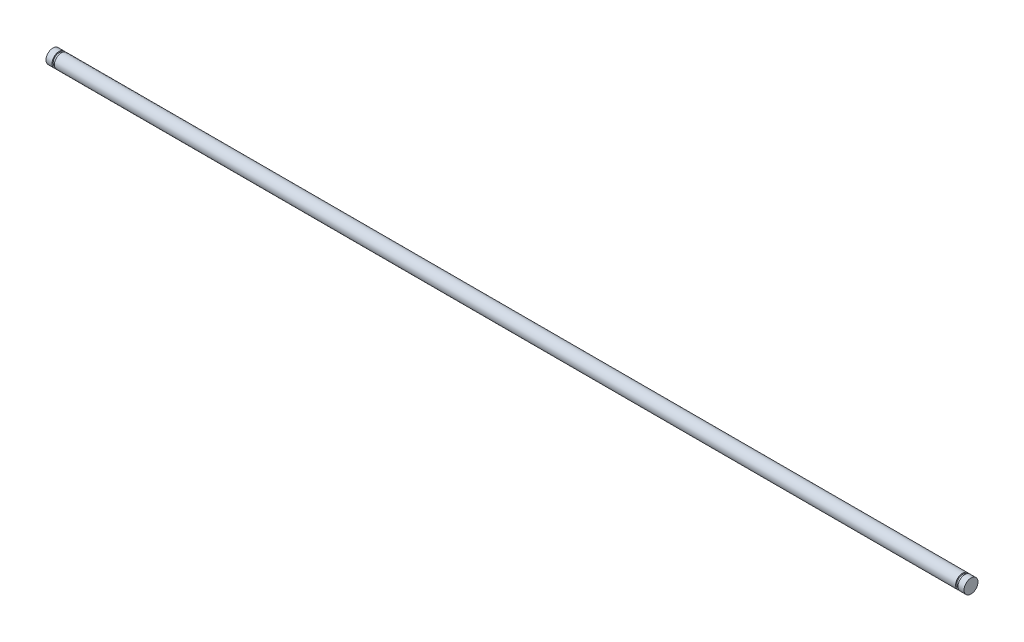
ISO-10303-21;
HEADER;
FILE_DESCRIPTION(('STEP AP214'),'2;1');
FILE_NAME('part.step','',(''),(''),'','','');
FILE_SCHEMA(('AUTOMOTIVE_DESIGN { 1 0 10303 214 1 1 1 1 }'));
ENDSEC;
DATA;
#1=APPLICATION_CONTEXT('core data for automotive mechanical design processes');
#2=APPLICATION_PROTOCOL_DEFINITION('international standard','automotive_design',2000,#1);
#3=PRODUCT_CONTEXT('',#1,'mechanical');
#4=PRODUCT('Part','Part','',(#3));
#5=PRODUCT_RELATED_PRODUCT_CATEGORY('part','',(#4));
#6=PRODUCT_DEFINITION_FORMATION('','',#4);
#7=PRODUCT_DEFINITION_CONTEXT('part definition',#1,'design');
#8=PRODUCT_DEFINITION('design','',#6,#7);
#9=PRODUCT_DEFINITION_SHAPE('','',#8);
#10=(LENGTH_UNIT() NAMED_UNIT(*) SI_UNIT(.MILLI.,.METRE.));
#11=(NAMED_UNIT(*) PLANE_ANGLE_UNIT() SI_UNIT($,.RADIAN.));
#12=(NAMED_UNIT(*) SI_UNIT($,.STERADIAN.) SOLID_ANGLE_UNIT());
#13=UNCERTAINTY_MEASURE_WITH_UNIT(LENGTH_MEASURE(1.E-05),#10,'distance_accuracy_value','');
#14=(GEOMETRIC_REPRESENTATION_CONTEXT(3) GLOBAL_UNCERTAINTY_ASSIGNED_CONTEXT((#13)) GLOBAL_UNIT_ASSIGNED_CONTEXT((#10,
#11,#12)) REPRESENTATION_CONTEXT('',''));
#15=CARTESIAN_POINT('',(0.,0.,0.));
#16=DIRECTION('',(0.,0.,1.));
#17=DIRECTION('',(1.,0.,0.));
#18=AXIS2_PLACEMENT_3D('',#15,#16,#17);
#19=CARTESIAN_POINT('',(197.,0.,0.));
#20=DIRECTION('',(-1.,0.,0.));
#21=DIRECTION('',(0.,0.,1.));
#22=AXIS2_PLACEMENT_3D('',#19,#20,#21);
#23=CYLINDRICAL_SURFACE('',#22,1.5);
#24=CARTESIAN_POINT('',(1.3,0.,0.));
#25=DIRECTION('',(1.,0.,0.));
#26=DIRECTION('',(0.,0.,-1.));
#27=AXIS2_PLACEMENT_3D('',#24,#25,#26);
#28=CIRCLE('',#27,1.5);
#29=CARTESIAN_POINT('',(1.3,0.,-1.5));
#30=VERTEX_POINT('',#29);
#31=EDGE_CURVE('E51',#30,#30,#28,.T.);
#32=ORIENTED_EDGE('',*,*,#31,.F.);
#33=EDGE_LOOP('',(#32));
#34=FACE_BOUND('',#33,.T.);
#35=CARTESIAN_POINT('',(0.,0.,0.));
#36=DIRECTION('',(1.,0.,0.));
#37=DIRECTION('',(0.,0.,-1.));
#38=AXIS2_PLACEMENT_3D('',#35,#36,#37);
#39=CIRCLE('',#38,1.5);
#40=CARTESIAN_POINT('',(0.,0.,-1.5));
#41=VERTEX_POINT('',#40);
#42=EDGE_CURVE('E34',#41,#41,#39,.T.);
#43=ORIENTED_EDGE('',*,*,#42,.T.);
#44=EDGE_LOOP('',(#43));
#45=FACE_BOUND('',#44,.T.);
#46=ADVANCED_FACE('F30',(#34,#45),#23,.T.);
#47=CARTESIAN_POINT('',(0.,0.,0.));
#48=DIRECTION('',(1.,0.,0.));
#49=DIRECTION('',(0.,0.,-1.));
#50=AXIS2_PLACEMENT_3D('',#47,#48,#49);
#51=PLANE('',#50);
#52=ORIENTED_EDGE('',*,*,#42,.F.);
#53=EDGE_LOOP('',(#52));
#54=FACE_BOUND('',#53,.T.);
#55=ADVANCED_FACE('F86',(#54),#51,.F.);
#56=CARTESIAN_POINT('',(1.3,1.5,0.));
#57=DIRECTION('',(-1.,0.,0.));
#58=DIRECTION('',(0.,0.,1.));
#59=AXIS2_PLACEMENT_3D('',#56,#57,#58);
#60=PLANE('',#59);
#61=CARTESIAN_POINT('',(1.3,0.,0.));
#62=DIRECTION('',(1.,0.,0.));
#63=DIRECTION('',(0.,0.,-1.));
#64=AXIS2_PLACEMENT_3D('',#61,#62,#63);
#65=CIRCLE('',#64,1.25);
#66=CARTESIAN_POINT('',(1.3,0.,-1.25));
#67=VERTEX_POINT('',#66);
#68=EDGE_CURVE('E41',#67,#67,#65,.T.);
#69=ORIENTED_EDGE('',*,*,#68,.F.);
#70=EDGE_LOOP('',(#69));
#71=FACE_BOUND('',#70,.T.);
#72=ORIENTED_EDGE('',*,*,#31,.T.);
#73=EDGE_LOOP('',(#72));
#74=FACE_BOUND('',#73,.T.);
#75=ADVANCED_FACE('F91',(#71,#74),#60,.F.);
#76=CARTESIAN_POINT('',(197.,0.,0.));
#77=DIRECTION('',(1.,0.,0.));
#78=DIRECTION('',(0.,0.,-1.));
#79=AXIS2_PLACEMENT_3D('',#76,#77,#78);
#80=CYLINDRICAL_SURFACE('',#79,1.25);
#81=CARTESIAN_POINT('',(1.8,0.,0.));
#82=DIRECTION('',(1.,0.,0.));
#83=DIRECTION('',(0.,0.,-1.));
#84=AXIS2_PLACEMENT_3D('',#81,#82,#83);
#85=CIRCLE('',#84,1.25);
#86=CARTESIAN_POINT('',(1.8,0.,-1.25));
#87=VERTEX_POINT('',#86);
#88=EDGE_CURVE('E45',#87,#87,#85,.T.);
#89=ORIENTED_EDGE('',*,*,#88,.F.);
#90=EDGE_LOOP('',(#89));
#91=FACE_BOUND('',#90,.T.);
#92=ORIENTED_EDGE('',*,*,#68,.T.);
#93=EDGE_LOOP('',(#92));
#94=FACE_BOUND('',#93,.T.);
#95=ADVANCED_FACE('F109',(#91,#94),#80,.T.);
#96=CARTESIAN_POINT('',(1.8,1.5,0.));
#97=DIRECTION('',(1.,0.,0.));
#98=DIRECTION('',(0.,0.,-1.));
#99=AXIS2_PLACEMENT_3D('',#96,#97,#98);
#100=PLANE('',#99);
#101=CARTESIAN_POINT('',(1.8,0.,0.));
#102=DIRECTION('',(1.,0.,0.));
#103=DIRECTION('',(0.,0.,-1.));
#104=AXIS2_PLACEMENT_3D('',#101,#102,#103);
#105=CIRCLE('',#104,1.5);
#106=CARTESIAN_POINT('',(1.8,0.,-1.5));
#107=VERTEX_POINT('',#106);
#108=EDGE_CURVE('E48',#107,#107,#105,.T.);
#109=ORIENTED_EDGE('',*,*,#108,.F.);
#110=EDGE_LOOP('',(#109));
#111=FACE_BOUND('',#110,.T.);
#112=ORIENTED_EDGE('',*,*,#88,.T.);
#113=EDGE_LOOP('',(#112));
#114=FACE_BOUND('',#113,.T.);
#115=ADVANCED_FACE('F82',(#111,#114),#100,.F.);
#116=CARTESIAN_POINT('',(195.2,0.,0.));
#117=DIRECTION('',(1.,0.,0.));
#118=DIRECTION('',(0.,0.,-1.));
#119=AXIS2_PLACEMENT_3D('',#116,#117,#118);
#120=CIRCLE('',#119,1.5);
#121=CARTESIAN_POINT('',(195.2,0.,-1.5));
#122=VERTEX_POINT('',#121);
#123=EDGE_CURVE('E60',#122,#122,#120,.T.);
#124=ORIENTED_EDGE('',*,*,#123,.F.);
#125=EDGE_LOOP('',(#124));
#126=FACE_BOUND('',#125,.T.);
#127=ORIENTED_EDGE('',*,*,#108,.T.);
#128=EDGE_LOOP('',(#127));
#129=FACE_BOUND('',#128,.T.);
#130=ADVANCED_FACE('F32',(#126,#129),#23,.T.);
#131=CARTESIAN_POINT('',(195.7,1.5,0.));
#132=DIRECTION('',(1.,0.,0.));
#133=DIRECTION('',(0.,0.,1.));
#134=AXIS2_PLACEMENT_3D('',#131,#132,#133);
#135=PLANE('',#134);
#136=CARTESIAN_POINT('',(195.7,0.,0.));
#137=DIRECTION('',(1.,0.,0.));
#138=DIRECTION('',(0.,0.,-1.));
#139=AXIS2_PLACEMENT_3D('',#136,#137,#138);
#140=CIRCLE('',#139,1.25);
#141=CARTESIAN_POINT('',(195.7,0.,-1.25));
#142=VERTEX_POINT('',#141);
#143=EDGE_CURVE('E54',#142,#142,#140,.T.);
#144=ORIENTED_EDGE('',*,*,#143,.T.);
#145=EDGE_LOOP('',(#144));
#146=FACE_BOUND('',#145,.T.);
#147=CARTESIAN_POINT('',(195.7,0.,0.));
#148=DIRECTION('',(1.,0.,0.));
#149=DIRECTION('',(0.,0.,-1.));
#150=AXIS2_PLACEMENT_3D('',#147,#148,#149);
#151=CIRCLE('',#150,1.5);
#152=CARTESIAN_POINT('',(195.7,0.,-1.5));
#153=VERTEX_POINT('',#152);
#154=EDGE_CURVE('E63',#153,#153,#151,.T.);
#155=ORIENTED_EDGE('',*,*,#154,.F.);
#156=EDGE_LOOP('',(#155));
#157=FACE_BOUND('',#156,.T.);
#158=ADVANCED_FACE('F70',(#146,#157),#135,.F.);
#159=CARTESIAN_POINT('',(0.,0.,0.));
#160=DIRECTION('',(-1.,0.,0.));
#161=DIRECTION('',(0.,0.,-1.));
#162=AXIS2_PLACEMENT_3D('',#159,#160,#161);
#163=CYLINDRICAL_SURFACE('',#162,1.25);
#164=CARTESIAN_POINT('',(195.2,0.,0.));
#165=DIRECTION('',(1.,0.,0.));
#166=DIRECTION('',(0.,0.,-1.));
#167=AXIS2_PLACEMENT_3D('',#164,#165,#166);
#168=CIRCLE('',#167,1.25);
#169=CARTESIAN_POINT('',(195.2,0.,-1.25));
#170=VERTEX_POINT('',#169);
#171=EDGE_CURVE('E57',#170,#170,#168,.T.);
#172=ORIENTED_EDGE('',*,*,#171,.T.);
#173=EDGE_LOOP('',(#172));
#174=FACE_BOUND('',#173,.T.);
#175=ORIENTED_EDGE('',*,*,#143,.F.);
#176=EDGE_LOOP('',(#175));
#177=FACE_BOUND('',#176,.T.);
#178=ADVANCED_FACE('F72',(#174,#177),#163,.T.);
#179=CARTESIAN_POINT('',(195.2,1.5,0.));
#180=DIRECTION('',(-1.,0.,0.));
#181=DIRECTION('',(0.,0.,-1.));
#182=AXIS2_PLACEMENT_3D('',#179,#180,#181);
#183=PLANE('',#182);
#184=ORIENTED_EDGE('',*,*,#123,.T.);
#185=EDGE_LOOP('',(#184));
#186=FACE_BOUND('',#185,.T.);
#187=ORIENTED_EDGE('',*,*,#171,.F.);
#188=EDGE_LOOP('',(#187));
#189=FACE_BOUND('',#188,.T.);
#190=ADVANCED_FACE('F79',(#186,#189),#183,.F.);
#191=CARTESIAN_POINT('',(197.,0.,0.));
#192=DIRECTION('',(1.,0.,0.));
#193=DIRECTION('',(0.,0.,-1.));
#194=AXIS2_PLACEMENT_3D('',#191,#192,#193);
#195=PLANE('',#194);
#196=CARTESIAN_POINT('',(197.,0.,0.));
#197=DIRECTION('',(1.,0.,0.));
#198=DIRECTION('',(0.,0.,-1.));
#199=AXIS2_PLACEMENT_3D('',#196,#197,#198);
#200=CIRCLE('',#199,1.5);
#201=CARTESIAN_POINT('',(197.,0.,-1.5));
#202=VERTEX_POINT('',#201);
#203=EDGE_CURVE('E10',#202,#202,#200,.T.);
#204=ORIENTED_EDGE('',*,*,#203,.T.);
#205=EDGE_LOOP('',(#204));
#206=FACE_BOUND('',#205,.T.);
#207=ADVANCED_FACE('F96',(#206),#195,.T.);
#208=ORIENTED_EDGE('',*,*,#154,.T.);
#209=EDGE_LOOP('',(#208));
#210=FACE_BOUND('',#209,.T.);
#211=ORIENTED_EDGE('',*,*,#203,.F.);
#212=EDGE_LOOP('',(#211));
#213=FACE_BOUND('',#212,.T.);
#214=ADVANCED_FACE('F67',(#210,#213),#23,.T.);
#215=CLOSED_SHELL('',(#46,#55,#75,#95,#115,#130,#158,#178,#190,#207,#214));
#216=MANIFOLD_SOLID_BREP('B2',#215);
#217=ADVANCED_BREP_SHAPE_REPRESENTATION('',(#18,#216),#14);
#218=SHAPE_DEFINITION_REPRESENTATION(#9,#217);
ENDSEC;
END-ISO-10303-21;
